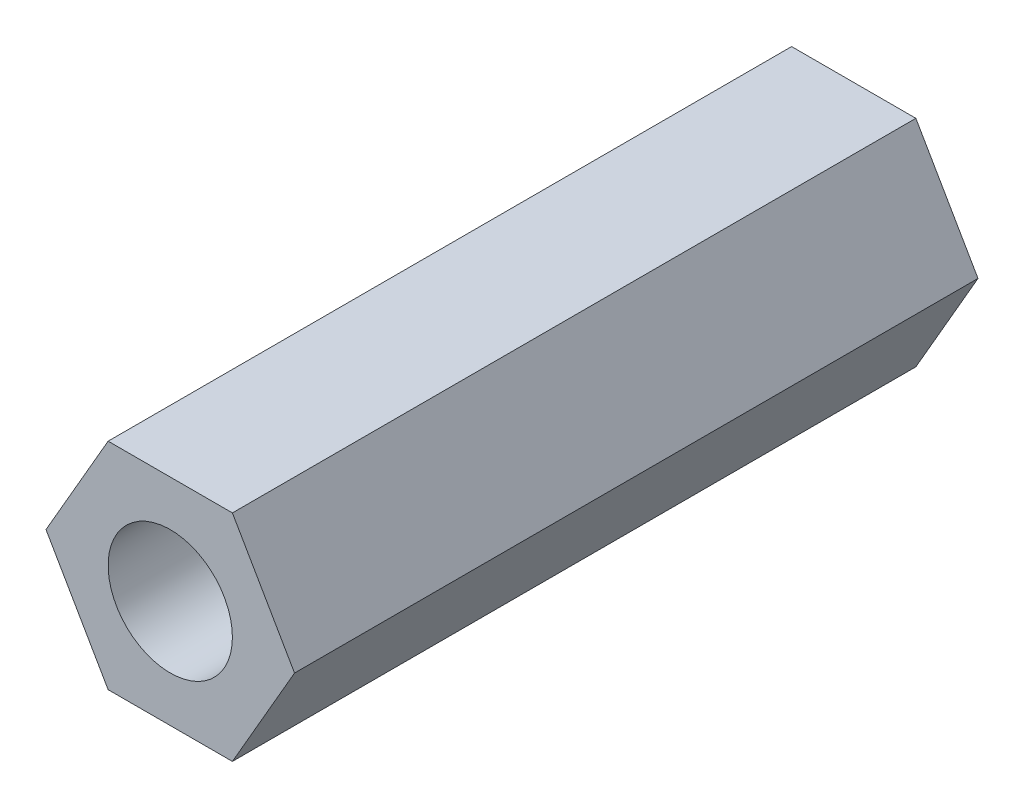
ISO-10303-21;
HEADER;
FILE_DESCRIPTION(('STEP AP214'),'2;1');
FILE_NAME('part.step','',(''),(''),'','','');
FILE_SCHEMA(('AUTOMOTIVE_DESIGN { 1 0 10303 214 1 1 1 1 }'));
ENDSEC;
DATA;
#1=APPLICATION_CONTEXT('core data for automotive mechanical design processes');
#2=APPLICATION_PROTOCOL_DEFINITION('international standard','automotive_design',2000,#1);
#3=PRODUCT_CONTEXT('',#1,'mechanical');
#4=PRODUCT('Part','Part','',(#3));
#5=PRODUCT_RELATED_PRODUCT_CATEGORY('part','',(#4));
#6=PRODUCT_DEFINITION_FORMATION('','',#4);
#7=PRODUCT_DEFINITION_CONTEXT('part definition',#1,'design');
#8=PRODUCT_DEFINITION('design','',#6,#7);
#9=PRODUCT_DEFINITION_SHAPE('','',#8);
#10=(LENGTH_UNIT() NAMED_UNIT(*) SI_UNIT(.MILLI.,.METRE.));
#11=(NAMED_UNIT(*) PLANE_ANGLE_UNIT() SI_UNIT($,.RADIAN.));
#12=(NAMED_UNIT(*) SI_UNIT($,.STERADIAN.) SOLID_ANGLE_UNIT());
#13=UNCERTAINTY_MEASURE_WITH_UNIT(LENGTH_MEASURE(1.E-05),#10,'distance_accuracy_value','');
#14=(GEOMETRIC_REPRESENTATION_CONTEXT(3) GLOBAL_UNCERTAINTY_ASSIGNED_CONTEXT((#13)) GLOBAL_UNIT_ASSIGNED_CONTEXT((#10,
#11,#12)) REPRESENTATION_CONTEXT('',''));
#15=CARTESIAN_POINT('',(0.,0.,0.));
#16=DIRECTION('',(0.,0.,1.));
#17=DIRECTION('',(1.,0.,0.));
#18=AXIS2_PLACEMENT_3D('',#15,#16,#17);
#19=CARTESIAN_POINT('',(0.,0.,22.));
#20=DIRECTION('',(0.,0.,1.));
#21=DIRECTION('',(1.,0.,0.));
#22=AXIS2_PLACEMENT_3D('',#19,#20,#21);
#23=PLANE('',#22);
#24=DIRECTION('',(0.500000000000003,0.866025403784437,0.));
#25=VECTOR('',#24,1.);
#26=CARTESIAN_POINT('',(31.7999999999924,26.3358983848397,22.));
#27=LINE('',#26,#25);
#28=CARTESIAN_POINT('',(31.7999999999924,26.3358983848397,22.));
#29=VERTEX_POINT('',#28);
#30=CARTESIAN_POINT('',(33.7999999999924,29.7999999999775,22.));
#31=VERTEX_POINT('',#30);
#32=EDGE_CURVE('E131',#29,#31,#27,.T.);
#33=ORIENTED_EDGE('',*,*,#32,.T.);
#34=DIRECTION('',(-0.5,0.866025403784439,0.));
#35=VECTOR('',#34,1.);
#36=CARTESIAN_POINT('',(33.7999999999924,29.7999999999775,22.));
#37=LINE('',#36,#35);
#38=CARTESIAN_POINT('',(31.7999999999924,33.2641016151152,22.));
#39=VERTEX_POINT('',#38);
#40=EDGE_CURVE('E89',#31,#39,#37,.T.);
#41=ORIENTED_EDGE('',*,*,#40,.T.);
#42=DIRECTION('',(-1.,0.,0.));
#43=VECTOR('',#42,1.);
#44=CARTESIAN_POINT('',(31.7999999999924,33.2641016151152,22.));
#45=LINE('',#44,#43);
#46=CARTESIAN_POINT('',(27.7999999999924,33.2641016151152,22.));
#47=VERTEX_POINT('',#46);
#48=EDGE_CURVE('E102',#39,#47,#45,.T.);
#49=ORIENTED_EDGE('',*,*,#48,.T.);
#50=DIRECTION('',(-0.500000000000001,-0.866025403784438,0.));
#51=VECTOR('',#50,1.);
#52=CARTESIAN_POINT('',(27.7999999999924,33.2641016151152,22.));
#53=LINE('',#52,#51);
#54=CARTESIAN_POINT('',(25.7999999999924,29.7999999999775,22.));
#55=VERTEX_POINT('',#54);
#56=EDGE_CURVE('E96',#47,#55,#53,.T.);
#57=ORIENTED_EDGE('',*,*,#56,.T.);
#58=DIRECTION('',(0.5,-0.866025403784439,0.));
#59=VECTOR('',#58,1.);
#60=CARTESIAN_POINT('',(25.7999999999924,29.7999999999775,22.));
#61=LINE('',#60,#59);
#62=CARTESIAN_POINT('',(27.7999999999924,26.3358983848397,22.));
#63=VERTEX_POINT('',#62);
#64=EDGE_CURVE('E100',#55,#63,#61,.T.);
#65=ORIENTED_EDGE('',*,*,#64,.T.);
#66=DIRECTION('',(1.,0.,0.));
#67=VECTOR('',#66,1.);
#68=CARTESIAN_POINT('',(27.7999999999924,26.3358983848397,22.));
#69=LINE('',#68,#67);
#70=EDGE_CURVE('E52',#63,#29,#69,.T.);
#71=ORIENTED_EDGE('',*,*,#70,.T.);
#72=EDGE_LOOP('',(#33,#41,#49,#57,#65,#71));
#73=FACE_BOUND('',#72,.T.);
#74=CARTESIAN_POINT('',(29.7999999999924,29.7999999999775,22.));
#75=DIRECTION('',(0.,0.,1.));
#76=DIRECTION('',(1.,0.,0.));
#77=AXIS2_PLACEMENT_3D('',#74,#75,#76);
#78=CIRCLE('',#77,2.);
#79=CARTESIAN_POINT('',(31.7999999999924,29.7999999999775,22.));
#80=VERTEX_POINT('',#79);
#81=EDGE_CURVE('E124',#80,#80,#78,.T.);
#82=ORIENTED_EDGE('',*,*,#81,.F.);
#83=EDGE_LOOP('',(#82));
#84=FACE_BOUND('',#83,.T.);
#85=ADVANCED_FACE('F35',(#73,#84),#23,.T.);
#86=CARTESIAN_POINT('',(0.,0.,0.));
#87=DIRECTION('',(0.,0.,1.));
#88=DIRECTION('',(1.,0.,0.));
#89=AXIS2_PLACEMENT_3D('',#86,#87,#88);
#90=PLANE('',#89);
#91=DIRECTION('',(0.500000000000003,0.866025403784437,0.));
#92=VECTOR('',#91,1.);
#93=CARTESIAN_POINT('',(31.7999999999924,26.3358983848397,0.));
#94=LINE('',#93,#92);
#95=CARTESIAN_POINT('',(31.7999999999924,26.3358983848397,0.));
#96=VERTEX_POINT('',#95);
#97=CARTESIAN_POINT('',(33.7999999999924,29.7999999999775,0.));
#98=VERTEX_POINT('',#97);
#99=EDGE_CURVE('E120',#96,#98,#94,.T.);
#100=ORIENTED_EDGE('',*,*,#99,.F.);
#101=DIRECTION('',(1.,0.,0.));
#102=VECTOR('',#101,1.);
#103=CARTESIAN_POINT('',(27.7999999999924,26.3358983848397,0.));
#104=LINE('',#103,#102);
#105=CARTESIAN_POINT('',(27.7999999999924,26.3358983848397,0.));
#106=VERTEX_POINT('',#105);
#107=EDGE_CURVE('E81',#106,#96,#104,.T.);
#108=ORIENTED_EDGE('',*,*,#107,.F.);
#109=DIRECTION('',(0.5,-0.866025403784439,0.));
#110=VECTOR('',#109,1.);
#111=CARTESIAN_POINT('',(25.7999999999924,29.7999999999775,0.));
#112=LINE('',#111,#110);
#113=CARTESIAN_POINT('',(25.7999999999924,29.7999999999775,0.));
#114=VERTEX_POINT('',#113);
#115=EDGE_CURVE('E75',#114,#106,#112,.T.);
#116=ORIENTED_EDGE('',*,*,#115,.F.);
#117=DIRECTION('',(-0.500000000000001,-0.866025403784438,0.));
#118=VECTOR('',#117,1.);
#119=CARTESIAN_POINT('',(27.7999999999924,33.2641016151152,0.));
#120=LINE('',#119,#118);
#121=CARTESIAN_POINT('',(27.7999999999924,33.2641016151152,0.));
#122=VERTEX_POINT('',#121);
#123=EDGE_CURVE('E110',#122,#114,#120,.T.);
#124=ORIENTED_EDGE('',*,*,#123,.F.);
#125=DIRECTION('',(-1.,0.,0.));
#126=VECTOR('',#125,1.);
#127=CARTESIAN_POINT('',(31.7999999999924,33.2641016151152,0.));
#128=LINE('',#127,#126);
#129=CARTESIAN_POINT('',(31.7999999999924,33.2641016151152,0.));
#130=VERTEX_POINT('',#129);
#131=EDGE_CURVE('E126',#130,#122,#128,.T.);
#132=ORIENTED_EDGE('',*,*,#131,.F.);
#133=DIRECTION('',(-0.5,0.866025403784439,0.));
#134=VECTOR('',#133,1.);
#135=CARTESIAN_POINT('',(33.7999999999924,29.7999999999775,0.));
#136=LINE('',#135,#134);
#137=EDGE_CURVE('E123',#98,#130,#136,.T.);
#138=ORIENTED_EDGE('',*,*,#137,.F.);
#139=EDGE_LOOP('',(#100,#108,#116,#124,#132,#138));
#140=FACE_BOUND('',#139,.T.);
#141=CARTESIAN_POINT('',(29.7999999999924,29.7999999999775,0.));
#142=DIRECTION('',(0.,0.,1.));
#143=DIRECTION('',(1.,0.,0.));
#144=AXIS2_PLACEMENT_3D('',#141,#142,#143);
#145=CIRCLE('',#144,2.);
#146=CARTESIAN_POINT('',(31.7999999999924,29.7999999999775,0.));
#147=VERTEX_POINT('',#146);
#148=EDGE_CURVE('E224',#147,#147,#145,.T.);
#149=ORIENTED_EDGE('',*,*,#148,.T.);
#150=EDGE_LOOP('',(#149));
#151=FACE_BOUND('',#150,.T.);
#152=ADVANCED_FACE('F140',(#140,#151),#90,.F.);
#153=CARTESIAN_POINT('',(31.7999999999924,26.3358983848397,22.));
#154=DIRECTION('',(-0.866025403784437,0.500000000000003,0.));
#155=DIRECTION('',(-0.500000000000003,-0.866025403784437,0.));
#156=AXIS2_PLACEMENT_3D('',#153,#154,#155);
#157=PLANE('',#156);
#158=ORIENTED_EDGE('',*,*,#99,.T.);
#159=DIRECTION('',(0.,0.,-1.));
#160=VECTOR('',#159,1.);
#161=CARTESIAN_POINT('',(33.7999999999924,29.7999999999775,22.));
#162=LINE('',#161,#160);
#163=EDGE_CURVE('E11',#31,#98,#162,.T.);
#164=ORIENTED_EDGE('',*,*,#163,.F.);
#165=ORIENTED_EDGE('',*,*,#32,.F.);
#166=DIRECTION('',(0.,0.,-1.));
#167=VECTOR('',#166,1.);
#168=CARTESIAN_POINT('',(31.7999999999924,26.3358983848397,22.));
#169=LINE('',#168,#167);
#170=EDGE_CURVE('E116',#29,#96,#169,.T.);
#171=ORIENTED_EDGE('',*,*,#170,.T.);
#172=EDGE_LOOP('',(#158,#164,#165,#171));
#173=FACE_BOUND('',#172,.T.);
#174=ADVANCED_FACE('F37',(#173),#157,.F.);
#175=CARTESIAN_POINT('',(33.7999999999924,29.7999999999775,22.));
#176=DIRECTION('',(-0.866025403784439,-0.5,0.));
#177=DIRECTION('',(0.5,-0.866025403784439,0.));
#178=AXIS2_PLACEMENT_3D('',#175,#176,#177);
#179=PLANE('',#178);
#180=ORIENTED_EDGE('',*,*,#137,.T.);
#181=DIRECTION('',(0.,0.,-1.));
#182=VECTOR('',#181,1.);
#183=CARTESIAN_POINT('',(31.7999999999924,33.2641016151152,22.));
#184=LINE('',#183,#182);
#185=EDGE_CURVE('E44',#39,#130,#184,.T.);
#186=ORIENTED_EDGE('',*,*,#185,.F.);
#187=ORIENTED_EDGE('',*,*,#40,.F.);
#188=ORIENTED_EDGE('',*,*,#163,.T.);
#189=EDGE_LOOP('',(#180,#186,#187,#188));
#190=FACE_BOUND('',#189,.T.);
#191=ADVANCED_FACE('F165',(#190),#179,.F.);
#192=CARTESIAN_POINT('',(31.7999999999924,33.2641016151152,22.));
#193=DIRECTION('',(0.,-1.,0.));
#194=DIRECTION('',(0.,0.,-1.));
#195=AXIS2_PLACEMENT_3D('',#192,#193,#194);
#196=PLANE('',#195);
#197=ORIENTED_EDGE('',*,*,#131,.T.);
#198=DIRECTION('',(0.,0.,-1.));
#199=VECTOR('',#198,1.);
#200=CARTESIAN_POINT('',(27.7999999999924,33.2641016151152,22.));
#201=LINE('',#200,#199);
#202=EDGE_CURVE('E111',#47,#122,#201,.T.);
#203=ORIENTED_EDGE('',*,*,#202,.F.);
#204=ORIENTED_EDGE('',*,*,#48,.F.);
#205=ORIENTED_EDGE('',*,*,#185,.T.);
#206=EDGE_LOOP('',(#197,#203,#204,#205));
#207=FACE_BOUND('',#206,.T.);
#208=ADVANCED_FACE('F137',(#207),#196,.F.);
#209=CARTESIAN_POINT('',(27.7999999999924,33.2641016151152,22.));
#210=DIRECTION('',(0.866025403784438,-0.500000000000001,0.));
#211=DIRECTION('',(0.500000000000001,0.866025403784438,0.));
#212=AXIS2_PLACEMENT_3D('',#209,#210,#211);
#213=PLANE('',#212);
#214=ORIENTED_EDGE('',*,*,#123,.T.);
#215=DIRECTION('',(0.,0.,-1.));
#216=VECTOR('',#215,1.);
#217=CARTESIAN_POINT('',(25.7999999999924,29.7999999999775,22.));
#218=LINE('',#217,#216);
#219=EDGE_CURVE('E107',#55,#114,#218,.T.);
#220=ORIENTED_EDGE('',*,*,#219,.F.);
#221=ORIENTED_EDGE('',*,*,#56,.F.);
#222=ORIENTED_EDGE('',*,*,#202,.T.);
#223=EDGE_LOOP('',(#214,#220,#221,#222));
#224=FACE_BOUND('',#223,.T.);
#225=ADVANCED_FACE('F108',(#224),#213,.F.);
#226=CARTESIAN_POINT('',(25.7999999999924,29.7999999999775,22.));
#227=DIRECTION('',(0.866025403784439,0.5,0.));
#228=DIRECTION('',(-0.5,0.866025403784439,0.));
#229=AXIS2_PLACEMENT_3D('',#226,#227,#228);
#230=PLANE('',#229);
#231=ORIENTED_EDGE('',*,*,#115,.T.);
#232=DIRECTION('',(0.,0.,-1.));
#233=VECTOR('',#232,1.);
#234=CARTESIAN_POINT('',(27.7999999999924,26.3358983848397,22.));
#235=LINE('',#234,#233);
#236=EDGE_CURVE('E112',#63,#106,#235,.T.);
#237=ORIENTED_EDGE('',*,*,#236,.F.);
#238=ORIENTED_EDGE('',*,*,#64,.F.);
#239=ORIENTED_EDGE('',*,*,#219,.T.);
#240=EDGE_LOOP('',(#231,#237,#238,#239));
#241=FACE_BOUND('',#240,.T.);
#242=ADVANCED_FACE('F114',(#241),#230,.F.);
#243=CARTESIAN_POINT('',(27.7999999999924,26.3358983848397,22.));
#244=DIRECTION('',(0.,1.,0.));
#245=DIRECTION('',(0.,0.,1.));
#246=AXIS2_PLACEMENT_3D('',#243,#244,#245);
#247=PLANE('',#246);
#248=ORIENTED_EDGE('',*,*,#107,.T.);
#249=ORIENTED_EDGE('',*,*,#170,.F.);
#250=ORIENTED_EDGE('',*,*,#70,.F.);
#251=ORIENTED_EDGE('',*,*,#236,.T.);
#252=EDGE_LOOP('',(#248,#249,#250,#251));
#253=FACE_BOUND('',#252,.T.);
#254=ADVANCED_FACE('F145',(#253),#247,.F.);
#255=CARTESIAN_POINT('',(29.7999999999924,29.7999999999775,22.));
#256=DIRECTION('',(0.,0.,-1.));
#257=DIRECTION('',(-1.,0.,0.));
#258=AXIS2_PLACEMENT_3D('',#255,#256,#257);
#259=CYLINDRICAL_SURFACE('',#258,2.);
#260=ORIENTED_EDGE('',*,*,#81,.T.);
#261=EDGE_LOOP('',(#260));
#262=FACE_BOUND('',#261,.T.);
#263=ORIENTED_EDGE('',*,*,#148,.F.);
#264=EDGE_LOOP('',(#263));
#265=FACE_BOUND('',#264,.T.);
#266=ADVANCED_FACE('F147',(#262,#265),#259,.F.);
#267=CLOSED_SHELL('',(#85,#152,#174,#191,#208,#225,#242,#254,#266));
#268=MANIFOLD_SOLID_BREP('B2',#267);
#269=ADVANCED_BREP_SHAPE_REPRESENTATION('',(#18,#268),#14);
#270=SHAPE_DEFINITION_REPRESENTATION(#9,#269);
ENDSEC;
END-ISO-10303-21;
